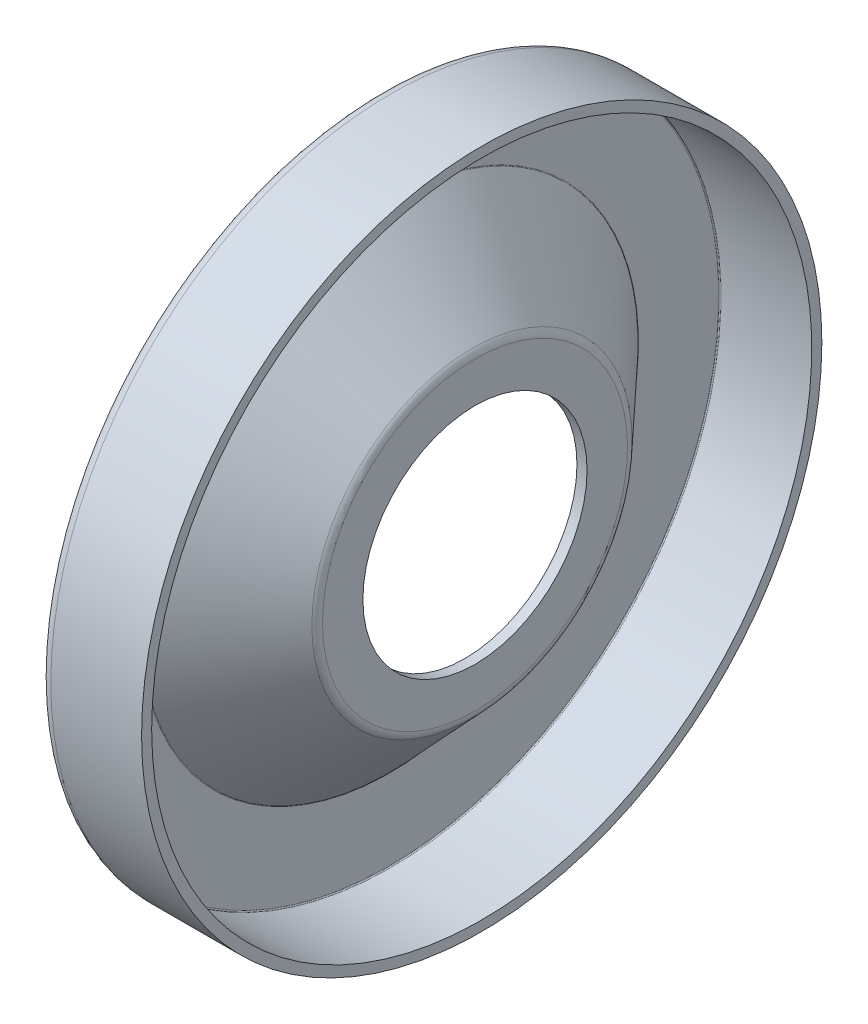
ISO-10303-21;
HEADER;
FILE_DESCRIPTION(('STEP AP214'),'2;1');
FILE_NAME('part.step','',(''),(''),'','','');
FILE_SCHEMA(('AUTOMOTIVE_DESIGN { 1 0 10303 214 1 1 1 1 }'));
ENDSEC;
DATA;
#1=APPLICATION_CONTEXT('core data for automotive mechanical design processes');
#2=APPLICATION_PROTOCOL_DEFINITION('international standard','automotive_design',2000,#1);
#3=PRODUCT_CONTEXT('',#1,'mechanical');
#4=PRODUCT('Part','Part','',(#3));
#5=PRODUCT_RELATED_PRODUCT_CATEGORY('part','',(#4));
#6=PRODUCT_DEFINITION_FORMATION('','',#4);
#7=PRODUCT_DEFINITION_CONTEXT('part definition',#1,'design');
#8=PRODUCT_DEFINITION('design','',#6,#7);
#9=PRODUCT_DEFINITION_SHAPE('','',#8);
#10=(LENGTH_UNIT() NAMED_UNIT(*) SI_UNIT(.MILLI.,.METRE.));
#11=(NAMED_UNIT(*) PLANE_ANGLE_UNIT() SI_UNIT($,.RADIAN.));
#12=(NAMED_UNIT(*) SI_UNIT($,.STERADIAN.) SOLID_ANGLE_UNIT());
#13=UNCERTAINTY_MEASURE_WITH_UNIT(LENGTH_MEASURE(1.E-05),#10,'distance_accuracy_value','');
#14=(GEOMETRIC_REPRESENTATION_CONTEXT(3) GLOBAL_UNCERTAINTY_ASSIGNED_CONTEXT((#13)) GLOBAL_UNIT_ASSIGNED_CONTEXT((#10,
#11,#12)) REPRESENTATION_CONTEXT('',''));
#15=CARTESIAN_POINT('',(0.,0.,0.));
#16=DIRECTION('',(0.,0.,1.));
#17=DIRECTION('',(1.,0.,0.));
#18=AXIS2_PLACEMENT_3D('',#15,#16,#17);
#19=CARTESIAN_POINT('',(0.,0.,0.));
#20=DIRECTION('',(-1.,0.,0.));
#21=DIRECTION('',(0.,0.,1.));
#22=AXIS2_PLACEMENT_3D('',#19,#20,#21);
#23=CYLINDRICAL_SURFACE('',#22,10.);
#24=CARTESIAN_POINT('',(0.,0.,0.));
#25=DIRECTION('',(-1.,0.,0.));
#26=DIRECTION('',(0.,0.,1.));
#27=AXIS2_PLACEMENT_3D('',#24,#25,#26);
#28=CIRCLE('',#27,10.);
#29=CARTESIAN_POINT('',(0.,0.,10.));
#30=VERTEX_POINT('',#29);
#31=EDGE_CURVE('E317',#30,#30,#28,.T.);
#32=CARTESIAN_POINT('',(0.900000000000012,0.,0.));
#33=DIRECTION('',(-1.,0.,0.));
#34=DIRECTION('',(0.,0.,1.));
#35=AXIS2_PLACEMENT_3D('',#32,#33,#34);
#36=CIRCLE('',#35,10.);
#37=CARTESIAN_POINT('',(0.900000000000012,0.,10.));
#38=VERTEX_POINT('',#37);
#39=EDGE_CURVE('E13',#38,#38,#36,.T.);
#40=CARTESIAN_POINT('',(0.,0.,10.));
#41=CARTESIAN_POINT('',(0.00937500000000032,0.,10.));
#42=CARTESIAN_POINT('',(0.0187500000000005,0.,10.));
#43=CARTESIAN_POINT('',(0.0375000000000007,0.,10.));
#44=CARTESIAN_POINT('',(0.0468750000000008,0.,10.));
#45=CARTESIAN_POINT('',(0.0656250000000011,0.,10.));
#46=CARTESIAN_POINT('',(0.0750000000000012,0.,10.));
#47=CARTESIAN_POINT('',(0.0937500000000014,0.,10.));
#48=CARTESIAN_POINT('',(0.103125000000002,0.,10.));
#49=CARTESIAN_POINT('',(0.121875000000002,0.,10.));
#50=CARTESIAN_POINT('',(0.131250000000002,0.,10.));
#51=CARTESIAN_POINT('',(0.150000000000002,0.,10.));
#52=CARTESIAN_POINT('',(0.159375000000002,0.,10.));
#53=CARTESIAN_POINT('',(0.178125000000003,0.,10.));
#54=CARTESIAN_POINT('',(0.187500000000003,0.,10.));
#55=CARTESIAN_POINT('',(0.206250000000003,0.,10.));
#56=CARTESIAN_POINT('',(0.215625000000003,0.,10.));
#57=CARTESIAN_POINT('',(0.234375000000003,0.,10.));
#58=CARTESIAN_POINT('',(0.243750000000003,0.,10.));
#59=CARTESIAN_POINT('',(0.262500000000004,0.,10.));
#60=CARTESIAN_POINT('',(0.271875000000004,0.,10.));
#61=CARTESIAN_POINT('',(0.290625000000004,0.,10.));
#62=CARTESIAN_POINT('',(0.300000000000004,0.,10.));
#63=CARTESIAN_POINT('',(0.318750000000004,0.,10.));
#64=CARTESIAN_POINT('',(0.328125000000004,0.,10.));
#65=CARTESIAN_POINT('',(0.346875000000005,0.,10.));
#66=CARTESIAN_POINT('',(0.356250000000005,0.,10.));
#67=CARTESIAN_POINT('',(0.375000000000005,0.,10.));
#68=CARTESIAN_POINT('',(0.384375000000005,0.,10.));
#69=CARTESIAN_POINT('',(0.403125000000006,0.,10.));
#70=CARTESIAN_POINT('',(0.412500000000006,0.,10.));
#71=CARTESIAN_POINT('',(0.431250000000006,0.,10.));
#72=CARTESIAN_POINT('',(0.440625000000006,0.,10.));
#73=CARTESIAN_POINT('',(0.459375000000006,0.,10.));
#74=CARTESIAN_POINT('',(0.468750000000006,0.,10.));
#75=CARTESIAN_POINT('',(0.487500000000007,0.,10.));
#76=CARTESIAN_POINT('',(0.496875000000007,0.,10.));
#77=CARTESIAN_POINT('',(0.515625000000007,0.,10.));
#78=CARTESIAN_POINT('',(0.525000000000007,0.,10.));
#79=CARTESIAN_POINT('',(0.543750000000007,0.,10.));
#80=CARTESIAN_POINT('',(0.553125000000008,0.,10.));
#81=CARTESIAN_POINT('',(0.571875000000008,0.,10.));
#82=CARTESIAN_POINT('',(0.581250000000008,0.,10.));
#83=CARTESIAN_POINT('',(0.600000000000008,0.,10.));
#84=CARTESIAN_POINT('',(0.609375000000008,0.,10.));
#85=CARTESIAN_POINT('',(0.628125000000008,0.,10.));
#86=CARTESIAN_POINT('',(0.637500000000009,0.,10.));
#87=CARTESIAN_POINT('',(0.656250000000009,0.,10.));
#88=CARTESIAN_POINT('',(0.665625000000009,0.,10.));
#89=CARTESIAN_POINT('',(0.684375000000009,0.,10.));
#90=CARTESIAN_POINT('',(0.693750000000009,0.,10.));
#91=CARTESIAN_POINT('',(0.71250000000001,0.,10.));
#92=CARTESIAN_POINT('',(0.72187500000001,0.,10.));
#93=CARTESIAN_POINT('',(0.74062500000001,0.,10.));
#94=CARTESIAN_POINT('',(0.75000000000001,0.,10.));
#95=CARTESIAN_POINT('',(0.76875000000001,0.,10.));
#96=CARTESIAN_POINT('',(0.778125000000011,0.,10.));
#97=CARTESIAN_POINT('',(0.796875000000011,0.,10.));
#98=CARTESIAN_POINT('',(0.806250000000011,0.,10.));
#99=CARTESIAN_POINT('',(0.825000000000011,0.,10.));
#100=CARTESIAN_POINT('',(0.834375000000011,0.,10.));
#101=CARTESIAN_POINT('',(0.853125000000011,0.,10.));
#102=CARTESIAN_POINT('',(0.862500000000012,0.,10.));
#103=CARTESIAN_POINT('',(0.881250000000012,0.,10.));
#104=CARTESIAN_POINT('',(0.890625000000012,0.,10.));
#105=CARTESIAN_POINT('',(0.900000000000012,0.,10.));
#106=B_SPLINE_CURVE_WITH_KNOTS('',3,(#40,#41,#42,#43,#44,#45,#46,#47,#48,#49,#50,#51,#52,#53,
#54,#55,#56,#57,#58,#59,#60,#61,#62,#63,#64,#65,#66,#67,#68,#69,#70,#71,#72,#73,#74,#75,#76,#77,
#78,#79,#80,#81,#82,#83,#84,#85,#86,#87,#88,#89,#90,#91,#92,#93,#94,#95,#96,#97,#98,#99,#100,
#101,#102,#103,#104,#105),.UNSPECIFIED.,.F.,.F.,(4,2,2,2,2,2,2,2,2,2,2,2,2,2,2,2,2,2,2,2,2,2,2,
2,2,2,2,2,2,2,2,2,4),(0.,0.0281250000000004,0.0562500000000007,0.0843750000000011,
0.112500000000001,0.140625000000002,0.168750000000002,0.196875000000003,0.225000000000003,
0.253125000000003,0.281250000000004,0.309375000000004,0.337500000000004,0.365625000000005,
0.393750000000005,0.421875000000006,0.450000000000006,0.478125000000006,0.506250000000007,
0.534375000000007,0.562500000000007,0.590625000000008,0.618750000000008,0.646875000000008,
0.675000000000009,0.703125000000009,0.73125000000001,0.75937500000001,0.78750000000001,
0.815625000000011,0.843750000000011,0.871875000000011,0.900000000000012),.UNSPECIFIED.);
#107=EDGE_CURVE('BSEAM265',#30,#38,#106,.T.);
#108=ORIENTED_EDGE('',*,*,#31,.T.);
#109=ORIENTED_EDGE('',*,*,#39,.F.);
#110=ORIENTED_EDGE('',*,*,#107,.T.);
#111=ORIENTED_EDGE('',*,*,#107,.F.);
#112=EDGE_LOOP('',(#108,#110,#109,#111));
#113=FACE_BOUND('',#112,.T.);
#114=ADVANCED_FACE('F265',(#113),#23,.F.);
#115=CARTESIAN_POINT('',(0.900000000000012,-10.,2.22044604925031E-13));
#116=DIRECTION('',(1.,0.,0.));
#117=DIRECTION('',(0.,0.,-1.));
#118=AXIS2_PLACEMENT_3D('',#115,#116,#117);
#119=PLANE('',#118);
#120=ORIENTED_EDGE('',*,*,#39,.T.);
#121=EDGE_LOOP('',(#120));
#122=FACE_BOUND('',#121,.T.);
#123=CARTESIAN_POINT('',(0.900000000000012,0.,0.));
#124=DIRECTION('',(-1.,0.,0.));
#125=DIRECTION('',(0.,0.,1.));
#126=AXIS2_PLACEMENT_3D('',#123,#124,#125);
#127=CIRCLE('',#126,13.6060895243851);
#128=CARTESIAN_POINT('',(0.900000000000011,0.,13.6060895243851));
#129=VERTEX_POINT('',#128);
#130=EDGE_CURVE('E271',#129,#129,#127,.T.);
#131=ORIENTED_EDGE('',*,*,#130,.F.);
#132=EDGE_LOOP('',(#131));
#133=FACE_BOUND('',#132,.T.);
#134=ADVANCED_FACE('F335',(#122,#133),#119,.T.);
#135=CARTESIAN_POINT('',(-0.099999999999989,0.,0.));
#136=DIRECTION('',(-1.,0.,0.));
#137=DIRECTION('',(0.,0.,1.));
#138=AXIS2_PLACEMENT_3D('',#135,#136,#137);
#139=TOROIDAL_SURFACE('',#138,13.6060895243851,1.);
#140=ORIENTED_EDGE('',*,*,#130,.T.);
#141=EDGE_LOOP('',(#140));
#142=FACE_BOUND('',#141,.T.);
#143=CARTESIAN_POINT('',(0.631353701619264,2.22044604925031E-13,0.));
#144=DIRECTION('',(-1.,0.,0.));
#145=DIRECTION('',(0.,0.,1.));
#146=AXIS2_PLACEMENT_3D('',#143,#144,#145);
#147=CIRCLE('',#146,14.2880878844476);
#148=CARTESIAN_POINT('',(0.631353701619265,-2.21639124327501E-13,14.2880878844475));
#149=VERTEX_POINT('',#148);
#150=EDGE_CURVE('E275',#149,#149,#147,.T.);
#151=ORIENTED_EDGE('',*,*,#150,.F.);
#152=EDGE_LOOP('',(#151));
#153=FACE_BOUND('',#152,.T.);
#154=ADVANCED_FACE('F339',(#142,#153),#139,.T.);
#155=CARTESIAN_POINT('',(-6.6731353701619,-2.22044604925031E-13,0.));
#156=DIRECTION('',(-1.,0.,0.));
#157=DIRECTION('',(0.,0.,1.));
#158=AXIS2_PLACEMENT_3D('',#155,#156,#157);
#159=CONICAL_SURFACE('',#158,22.1211934077428,0.820304748437334);
#160=CARTESIAN_POINT('',(-6.6731353701619,-2.22044604925031E-13,0.));
#161=DIRECTION('',(-1.,0.,0.));
#162=DIRECTION('',(0.,0.,1.));
#163=AXIS2_PLACEMENT_3D('',#160,#161,#162);
#164=CIRCLE('',#163,22.1211934077428);
#165=CARTESIAN_POINT('',(-6.6731353701619,-2.22044604925031E-13,22.1211934077428));
#166=VERTEX_POINT('',#165);
#167=EDGE_CURVE('E279',#166,#166,#164,.T.);
#168=CARTESIAN_POINT('',(0.631353701619265,-2.21639124327501E-13,14.2880878844475));
#169=CARTESIAN_POINT('',(0.555265273788211,-2.21643348083725E-13,14.3696827336485));
#170=CARTESIAN_POINT('',(0.479176845957157,-2.21647571839949E-13,14.4512775828494));
#171=CARTESIAN_POINT('',(0.32699999029505,-2.21656019352398E-13,14.6144672812514));
#172=CARTESIAN_POINT('',(0.250911562463996,-2.21660243108622E-13,14.6960621304524));
#173=CARTESIAN_POINT('',(0.0987347068018886,-2.21668690621071E-13,14.8592518288544));
#174=CARTESIAN_POINT('',(0.022646278970835,-2.21672914377295E-13,14.9408466780554));
#175=CARTESIAN_POINT('',(-0.129530576691272,-2.21681361889743E-13,15.1040363764574));
#176=CARTESIAN_POINT('',(-0.205619004522326,-2.21685585645968E-13,15.1856312256584));
#177=CARTESIAN_POINT('',(-0.357795860184434,-2.21694033158416E-13,15.3488209240604));
#178=CARTESIAN_POINT('',(-0.433884288015488,-2.2169825691464E-13,15.4304157732614));
#179=CARTESIAN_POINT('',(-0.586061143677596,-2.21706704427089E-13,15.5936054716634));
#180=CARTESIAN_POINT('',(-0.66214957150865,-2.21710928183313E-13,15.6752003208643));
#181=CARTESIAN_POINT('',(-0.814326427170757,-2.21719375695762E-13,15.8383900192663));
#182=CARTESIAN_POINT('',(-0.89041485500181,-2.21723599451986E-13,15.9199848684673));
#183=CARTESIAN_POINT('',(-1.04259171066392,-2.21732046964435E-13,16.0831745668693));
#184=CARTESIAN_POINT('',(-1.11868013849497,-2.21736270720659E-13,16.1647694160703));
#185=CARTESIAN_POINT('',(-1.27085699415708,-2.21744718233108E-13,16.3279591144723));
#186=CARTESIAN_POINT('',(-1.34694542198813,-2.21748941989332E-13,16.4095539636733));
#187=CARTESIAN_POINT('',(-1.49912227765024,-2.2175738950178E-13,16.5727436620753));
#188=CARTESIAN_POINT('',(-1.5752107054813,-2.21761613258005E-13,16.6543385112763));
#189=CARTESIAN_POINT('',(-1.7273875611434,-2.21770060770453E-13,16.8175282096782));
#190=CARTESIAN_POINT('',(-1.80347598897446,-2.21774284526677E-13,16.8991230588792));
#191=CARTESIAN_POINT('',(-1.95565284463656,-2.21782732039126E-13,17.0623127572812));
#192=CARTESIAN_POINT('',(-2.03174127246762,-2.2178695579535E-13,17.1439076064822));
#193=CARTESIAN_POINT('',(-2.18391812812973,-2.21795403307799E-13,17.3070973048842));
#194=CARTESIAN_POINT('',(-2.26000655596078,-2.21799627064023E-13,17.3886921540852));
#195=CARTESIAN_POINT('',(-2.41218341162289,-2.21808074576472E-13,17.5518818524872));
#196=CARTESIAN_POINT('',(-2.48827183945394,-2.21812298332696E-13,17.6334767016882));
#197=CARTESIAN_POINT('',(-2.64044869511605,-2.21820745845145E-13,17.7966664000902));
#198=CARTESIAN_POINT('',(-2.7165371229471,-2.21824969601369E-13,17.8782612492912));
#199=CARTESIAN_POINT('',(-2.86871397860921,-2.21833417113817E-13,18.0414509476931));
#200=CARTESIAN_POINT('',(-2.94480240644026,-2.21837640870042E-13,18.1230457968941));
#201=CARTESIAN_POINT('',(-3.09697926210237,-2.2184608838249E-13,18.2862354952961));
#202=CARTESIAN_POINT('',(-3.17306768993342,-2.21850312138715E-13,18.3678303444971));
#203=CARTESIAN_POINT('',(-3.32524454559553,-2.21858759651163E-13,18.5310200428991));
#204=CARTESIAN_POINT('',(-3.40133297342659,-2.21862983407387E-13,18.6126148921001));
#205=CARTESIAN_POINT('',(-3.55350982908869,-2.21871430919836E-13,18.7758045905021));
#206=CARTESIAN_POINT('',(-3.62959825691975,-2.2187565467606E-13,18.8573994397031));
#207=CARTESIAN_POINT('',(-3.78177511258185,-2.21884102188509E-13,19.0205891381051));
#208=CARTESIAN_POINT('',(-3.85786354041291,-2.21888325944733E-13,19.1021839873061));
#209=CARTESIAN_POINT('',(-4.01004039607502,-2.21896773457182E-13,19.265373685708));
#210=CARTESIAN_POINT('',(-4.08612882390607,-2.21900997213406E-13,19.346968534909));
#211=CARTESIAN_POINT('',(-4.23830567956818,-2.21909444725854E-13,19.510158233311));
#212=CARTESIAN_POINT('',(-4.31439410739923,-2.21913668482079E-13,19.591753082512));
#213=CARTESIAN_POINT('',(-4.46657096306134,-2.21922115994527E-13,19.754942780914));
#214=CARTESIAN_POINT('',(-4.54265939089239,-2.21926339750752E-13,19.836537630115));
#215=CARTESIAN_POINT('',(-4.6948362465545,-2.219347872632E-13,19.999727328517));
#216=CARTESIAN_POINT('',(-4.77092467438555,-2.21939011019424E-13,20.081322177718));
#217=CARTESIAN_POINT('',(-4.92310153004766,-2.21947458531873E-13,20.24451187612));
#218=CARTESIAN_POINT('',(-4.99918995787872,-2.21951682288097E-13,20.326106725321));
#219=CARTESIAN_POINT('',(-5.15136681354082,-2.21960129800546E-13,20.4892964237229));
#220=CARTESIAN_POINT('',(-5.22745524137188,-2.2196435355677E-13,20.5708912729239));
#221=CARTESIAN_POINT('',(-5.37963209703398,-2.21972801069219E-13,20.7340809713259));
#222=CARTESIAN_POINT('',(-5.45572052486504,-2.21977024825443E-13,20.8156758205269));
#223=CARTESIAN_POINT('',(-5.60789738052715,-2.21985472337891E-13,20.9788655189289));
#224=CARTESIAN_POINT('',(-5.6839858083582,-2.21989696094116E-13,21.0604603681299));
#225=CARTESIAN_POINT('',(-5.83616266402031,-2.21998143606564E-13,21.2236500665319));
#226=CARTESIAN_POINT('',(-5.91225109185136,-2.22002367362789E-13,21.3052449157329));
#227=CARTESIAN_POINT('',(-6.06442794751347,-2.22010814875237E-13,21.4684346141349));
#228=CARTESIAN_POINT('',(-6.14051637534452,-2.22015038631461E-13,21.5500294633359));
#229=CARTESIAN_POINT('',(-6.29269323100663,-2.2202348614391E-13,21.7132191617378));
#230=CARTESIAN_POINT('',(-6.36878165883768,-2.22027709900134E-13,21.7948140109388));
#231=CARTESIAN_POINT('',(-6.52095851449979,-2.22036157412583E-13,21.9580037093408));
#232=CARTESIAN_POINT('',(-6.59704694233084,-2.22040381168807E-13,22.0395985585418));
#233=CARTESIAN_POINT('',(-6.6731353701619,-2.22044604925031E-13,22.1211934077428));
#234=B_SPLINE_CURVE_WITH_KNOTS('',3,(#168,#169,#170,#171,#172,#173,#174,#175,#176,#177,#178,
#179,#180,#181,#182,#183,#184,#185,#186,#187,#188,#189,#190,#191,#192,#193,#194,#195,#196,#197,
#198,#199,#200,#201,#202,#203,#204,#205,#206,#207,#208,#209,#210,#211,#212,#213,#214,#215,#216,
#217,#218,#219,#220,#221,#222,#223,#224,#225,#226,#227,#228,#229,#230,#231,#232,#233),
.UNSPECIFIED.,.F.,.F.,(4,2,2,2,2,2,2,2,2,2,2,2,2,2,2,2,2,2,2,2,2,2,2,2,2,2,2,2,2,2,2,2,4),(0.,
0.334700633990149,0.6694012679803,1.00410190197045,1.3388025359606,1.67350316995075,
2.0082038039409,2.34290443793105,2.6776050719212,3.01230570591135,3.3470063399015,
3.68170697389165,4.0164076078818,4.35110824187196,4.6858088758621,5.02050950985225,
5.35521014384241,5.68991077783256,6.02461141182271,6.35931204581286,6.69401267980301,
7.02871331379316,7.36341394778331,7.69811458177346,8.03281521576361,8.36751584975376,
8.70221648374391,9.03691711773406,9.37161775172421,9.70631838571436,10.0410190197045,
10.3757196536947,10.7104202876848),.UNSPECIFIED.);
#235=EDGE_CURVE('BSEAM343',#149,#166,#234,.T.);
#236=ORIENTED_EDGE('',*,*,#150,.T.);
#237=ORIENTED_EDGE('',*,*,#167,.F.);
#238=ORIENTED_EDGE('',*,*,#235,.T.);
#239=ORIENTED_EDGE('',*,*,#235,.F.);
#240=EDGE_LOOP('',(#236,#238,#237,#239));
#241=FACE_BOUND('',#240,.T.);
#242=ADVANCED_FACE('F343',(#241),#159,.T.);
#243=CARTESIAN_POINT('',(-6.59999999999994,2.22044604925031E-13,1.11022302462516E-13));
#244=DIRECTION('',(-1.,0.,0.));
#245=DIRECTION('',(0.,0.,1.));
#246=AXIS2_PLACEMENT_3D('',#243,#244,#245);
#247=TOROIDAL_SURFACE('',#246,22.1893932437491,0.0999999999999989);
#248=ORIENTED_EDGE('',*,*,#167,.T.);
#249=EDGE_LOOP('',(#248));
#250=FACE_BOUND('',#249,.T.);
#251=CARTESIAN_POINT('',(-6.69999999999998,0.,0.));
#252=DIRECTION('',(-1.,0.,0.));
#253=DIRECTION('',(0.,0.,1.));
#254=AXIS2_PLACEMENT_3D('',#251,#252,#253);
#255=CIRCLE('',#254,22.1893932437491);
#256=CARTESIAN_POINT('',(-6.69999999999998,0.,22.1893932437491));
#257=VERTEX_POINT('',#256);
#258=EDGE_CURVE('E284',#257,#257,#255,.T.);
#259=ORIENTED_EDGE('',*,*,#258,.F.);
#260=EDGE_LOOP('',(#259));
#261=FACE_BOUND('',#260,.T.);
#262=ADVANCED_FACE('F349',(#250,#261),#247,.F.);
#263=CARTESIAN_POINT('',(-6.69999999999993,-22.1893932437491,1.11022302462516E-13));
#264=DIRECTION('',(1.,0.,0.));
#265=DIRECTION('',(0.,0.,-1.));
#266=AXIS2_PLACEMENT_3D('',#263,#264,#265);
#267=PLANE('',#266);
#268=ORIENTED_EDGE('',*,*,#258,.T.);
#269=EDGE_LOOP('',(#268));
#270=FACE_BOUND('',#269,.T.);
#271=CARTESIAN_POINT('',(-6.69999999999998,0.,0.));
#272=DIRECTION('',(-1.,0.,0.));
#273=DIRECTION('',(0.,0.,1.));
#274=AXIS2_PLACEMENT_3D('',#271,#272,#273);
#275=CIRCLE('',#274,29.35);
#276=CARTESIAN_POINT('',(-6.69999999999999,0.,29.3500000000001));
#277=VERTEX_POINT('',#276);
#278=EDGE_CURVE('E287',#277,#277,#275,.T.);
#279=ORIENTED_EDGE('',*,*,#278,.F.);
#280=EDGE_LOOP('',(#279));
#281=FACE_BOUND('',#280,.T.);
#282=ADVANCED_FACE('F353',(#270,#281),#267,.T.);
#283=CARTESIAN_POINT('',(-6.59999999999994,2.22044604925031E-13,1.11022302462516E-13));
#284=DIRECTION('',(-1.,0.,0.));
#285=DIRECTION('',(0.,0.,1.));
#286=AXIS2_PLACEMENT_3D('',#283,#284,#285);
#287=TOROIDAL_SURFACE('',#286,29.35,0.0999999999999998);
#288=ORIENTED_EDGE('',*,*,#278,.T.);
#289=EDGE_LOOP('',(#288));
#290=FACE_BOUND('',#289,.T.);
#291=CARTESIAN_POINT('',(-6.59999999999994,2.22044604925031E-13,1.11022302462516E-13));
#292=DIRECTION('',(-1.,0.,0.));
#293=DIRECTION('',(0.,0.,1.));
#294=AXIS2_PLACEMENT_3D('',#291,#292,#293);
#295=CIRCLE('',#294,29.45);
#296=CARTESIAN_POINT('',(-6.59999999999994,0.,29.45));
#297=VERTEX_POINT('',#296);
#298=EDGE_CURVE('E290',#297,#297,#295,.T.);
#299=ORIENTED_EDGE('',*,*,#298,.F.);
#300=EDGE_LOOP('',(#299));
#301=FACE_BOUND('',#300,.T.);
#302=ADVANCED_FACE('F357',(#290,#301),#287,.F.);
#303=CARTESIAN_POINT('',(0.,0.,0.));
#304=DIRECTION('',(-1.,0.,0.));
#305=DIRECTION('',(0.,0.,1.));
#306=AXIS2_PLACEMENT_3D('',#303,#304,#305);
#307=CYLINDRICAL_SURFACE('',#306,29.45);
#308=CARTESIAN_POINT('',(1.50000000000006,2.22044604925031E-13,0.));
#309=DIRECTION('',(-1.,0.,0.));
#310=DIRECTION('',(0.,0.,1.));
#311=AXIS2_PLACEMENT_3D('',#308,#309,#310);
#312=CIRCLE('',#311,29.45);
#313=CARTESIAN_POINT('',(1.50000000000006,0.,29.45));
#314=VERTEX_POINT('',#313);
#315=EDGE_CURVE('E293',#314,#314,#312,.T.);
#316=CARTESIAN_POINT('',(-6.59999999999994,0.,29.45));
#317=CARTESIAN_POINT('',(-6.51562499999994,0.,29.45));
#318=CARTESIAN_POINT('',(-6.43124999999994,0.,29.45));
#319=CARTESIAN_POINT('',(-6.26249999999994,0.,29.45));
#320=CARTESIAN_POINT('',(-6.17812499999994,0.,29.45));
#321=CARTESIAN_POINT('',(-6.00937499999994,0.,29.45));
#322=CARTESIAN_POINT('',(-5.92499999999994,0.,29.45));
#323=CARTESIAN_POINT('',(-5.75624999999994,0.,29.45));
#324=CARTESIAN_POINT('',(-5.67187499999994,0.,29.45));
#325=CARTESIAN_POINT('',(-5.50312499999994,0.,29.45));
#326=CARTESIAN_POINT('',(-5.41874999999994,0.,29.45));
#327=CARTESIAN_POINT('',(-5.24999999999994,0.,29.45));
#328=CARTESIAN_POINT('',(-5.16562499999994,0.,29.45));
#329=CARTESIAN_POINT('',(-4.99687499999994,0.,29.45));
#330=CARTESIAN_POINT('',(-4.91249999999994,0.,29.45));
#331=CARTESIAN_POINT('',(-4.74374999999994,0.,29.45));
#332=CARTESIAN_POINT('',(-4.65937499999994,0.,29.45));
#333=CARTESIAN_POINT('',(-4.49062499999994,0.,29.45));
#334=CARTESIAN_POINT('',(-4.40624999999994,0.,29.45));
#335=CARTESIAN_POINT('',(-4.23749999999994,0.,29.45));
#336=CARTESIAN_POINT('',(-4.15312499999994,0.,29.45));
#337=CARTESIAN_POINT('',(-3.98437499999994,0.,29.45));
#338=CARTESIAN_POINT('',(-3.89999999999994,0.,29.45));
#339=CARTESIAN_POINT('',(-3.73124999999994,0.,29.45));
#340=CARTESIAN_POINT('',(-3.64687499999994,0.,29.45));
#341=CARTESIAN_POINT('',(-3.47812499999994,0.,29.45));
#342=CARTESIAN_POINT('',(-3.39374999999994,0.,29.45));
#343=CARTESIAN_POINT('',(-3.22499999999994,0.,29.45));
#344=CARTESIAN_POINT('',(-3.14062499999994,0.,29.45));
#345=CARTESIAN_POINT('',(-2.97187499999994,0.,29.45));
#346=CARTESIAN_POINT('',(-2.88749999999994,0.,29.45));
#347=CARTESIAN_POINT('',(-2.71874999999994,0.,29.45));
#348=CARTESIAN_POINT('',(-2.63437499999994,0.,29.45));
#349=CARTESIAN_POINT('',(-2.46562499999994,0.,29.45));
#350=CARTESIAN_POINT('',(-2.38124999999994,0.,29.45));
#351=CARTESIAN_POINT('',(-2.21249999999994,0.,29.45));
#352=CARTESIAN_POINT('',(-2.12812499999994,0.,29.45));
#353=CARTESIAN_POINT('',(-1.95937499999994,0.,29.45));
#354=CARTESIAN_POINT('',(-1.87499999999994,0.,29.45));
#355=CARTESIAN_POINT('',(-1.70624999999994,0.,29.45));
#356=CARTESIAN_POINT('',(-1.62187499999994,0.,29.45));
#357=CARTESIAN_POINT('',(-1.45312499999994,0.,29.45));
#358=CARTESIAN_POINT('',(-1.36874999999994,0.,29.45));
#359=CARTESIAN_POINT('',(-1.19999999999994,0.,29.45));
#360=CARTESIAN_POINT('',(-1.11562499999994,0.,29.45));
#361=CARTESIAN_POINT('',(-0.946874999999941,0.,29.45));
#362=CARTESIAN_POINT('',(-0.862499999999941,0.,29.45));
#363=CARTESIAN_POINT('',(-0.693749999999941,0.,29.45));
#364=CARTESIAN_POINT('',(-0.609374999999941,0.,29.45));
#365=CARTESIAN_POINT('',(-0.440624999999941,0.,29.45));
#366=CARTESIAN_POINT('',(-0.356249999999941,0.,29.45));
#367=CARTESIAN_POINT('',(-0.187499999999941,0.,29.45));
#368=CARTESIAN_POINT('',(-0.103124999999941,0.,29.45));
#369=CARTESIAN_POINT('',(0.0656250000000585,0.,29.45));
#370=CARTESIAN_POINT('',(0.150000000000058,0.,29.45));
#371=CARTESIAN_POINT('',(0.318750000000059,0.,29.45));
#372=CARTESIAN_POINT('',(0.403125000000059,0.,29.45));
#373=CARTESIAN_POINT('',(0.571875000000059,0.,29.45));
#374=CARTESIAN_POINT('',(0.656250000000059,0.,29.45));
#375=CARTESIAN_POINT('',(0.825000000000059,0.,29.45));
#376=CARTESIAN_POINT('',(0.909375000000058,0.,29.45));
#377=CARTESIAN_POINT('',(1.07812500000006,0.,29.45));
#378=CARTESIAN_POINT('',(1.16250000000006,0.,29.45));
#379=CARTESIAN_POINT('',(1.33125000000006,0.,29.45));
#380=CARTESIAN_POINT('',(1.41562500000006,0.,29.45));
#381=CARTESIAN_POINT('',(1.50000000000006,0.,29.45));
#382=B_SPLINE_CURVE_WITH_KNOTS('',3,(#316,#317,#318,#319,#320,#321,#322,#323,#324,#325,#326,
#327,#328,#329,#330,#331,#332,#333,#334,#335,#336,#337,#338,#339,#340,#341,#342,#343,#344,#345,
#346,#347,#348,#349,#350,#351,#352,#353,#354,#355,#356,#357,#358,#359,#360,#361,#362,#363,#364,
#365,#366,#367,#368,#369,#370,#371,#372,#373,#374,#375,#376,#377,#378,#379,#380,#381),
.UNSPECIFIED.,.F.,.F.,(4,2,2,2,2,2,2,2,2,2,2,2,2,2,2,2,2,2,2,2,2,2,2,2,2,2,2,2,2,2,2,2,4),(0.,
0.253125,0.50625,0.759375,1.0125,1.265625,1.51875,1.771875,2.025,2.278125,2.53125,2.784375,
3.0375,3.290625,3.54375,3.796875,4.05,4.303125,4.55625,4.809375,5.0625,5.315625,5.56875,
5.821875,6.075,6.328125,6.58125,6.834375,7.0875,7.340625,7.59375,7.846875,8.1),.UNSPECIFIED.);
#383=EDGE_CURVE('BSEAM361',#297,#314,#382,.T.);
#384=ORIENTED_EDGE('',*,*,#298,.T.);
#385=ORIENTED_EDGE('',*,*,#315,.F.);
#386=ORIENTED_EDGE('',*,*,#383,.T.);
#387=ORIENTED_EDGE('',*,*,#383,.F.);
#388=EDGE_LOOP('',(#384,#386,#385,#387));
#389=FACE_BOUND('',#388,.T.);
#390=ADVANCED_FACE('F361',(#389),#307,.F.);
#391=CARTESIAN_POINT('',(1.50000000000006,-29.45,0.));
#392=DIRECTION('',(1.,0.,0.));
#393=DIRECTION('',(0.,0.,-1.));
#394=AXIS2_PLACEMENT_3D('',#391,#392,#393);
#395=PLANE('',#394);
#396=ORIENTED_EDGE('',*,*,#315,.T.);
#397=EDGE_LOOP('',(#396));
#398=FACE_BOUND('',#397,.T.);
#399=CARTESIAN_POINT('',(1.50000000000006,2.22044604925031E-13,0.));
#400=DIRECTION('',(-1.,0.,0.));
#401=DIRECTION('',(0.,0.,1.));
#402=AXIS2_PLACEMENT_3D('',#399,#400,#401);
#403=CIRCLE('',#402,30.35);
#404=CARTESIAN_POINT('',(1.50000000000006,0.,30.35));
#405=VERTEX_POINT('',#404);
#406=EDGE_CURVE('E296',#405,#405,#403,.T.);
#407=ORIENTED_EDGE('',*,*,#406,.F.);
#408=EDGE_LOOP('',(#407));
#409=FACE_BOUND('',#408,.T.);
#410=ADVANCED_FACE('F365',(#398,#409),#395,.T.);
#411=CARTESIAN_POINT('',(0.,0.,0.));
#412=DIRECTION('',(-1.,0.,0.));
#413=DIRECTION('',(0.,0.,1.));
#414=AXIS2_PLACEMENT_3D('',#411,#412,#413);
#415=CYLINDRICAL_SURFACE('',#414,30.35);
#416=CARTESIAN_POINT('',(-6.59999999999994,2.22044604925031E-13,1.11022302462516E-13));
#417=DIRECTION('',(-1.,0.,0.));
#418=DIRECTION('',(0.,0.,1.));
#419=AXIS2_PLACEMENT_3D('',#416,#417,#418);
#420=CIRCLE('',#419,30.35);
#421=CARTESIAN_POINT('',(-6.59999999999994,0.,30.35));
#422=VERTEX_POINT('',#421);
#423=EDGE_CURVE('E299',#422,#422,#420,.T.);
#424=CARTESIAN_POINT('',(1.50000000000006,0.,30.35));
#425=CARTESIAN_POINT('',(1.41562500000006,0.,30.35));
#426=CARTESIAN_POINT('',(1.33125000000006,0.,30.35));
#427=CARTESIAN_POINT('',(1.16250000000006,0.,30.35));
#428=CARTESIAN_POINT('',(1.07812500000006,0.,30.35));
#429=CARTESIAN_POINT('',(0.909375000000058,0.,30.35));
#430=CARTESIAN_POINT('',(0.825000000000058,0.,30.35));
#431=CARTESIAN_POINT('',(0.656250000000058,0.,30.35));
#432=CARTESIAN_POINT('',(0.571875000000058,0.,30.35));
#433=CARTESIAN_POINT('',(0.403125000000058,0.,30.35));
#434=CARTESIAN_POINT('',(0.318750000000058,0.,30.35));
#435=CARTESIAN_POINT('',(0.150000000000058,0.,30.35));
#436=CARTESIAN_POINT('',(0.0656250000000583,0.,30.35));
#437=CARTESIAN_POINT('',(-0.103124999999942,0.,30.35));
#438=CARTESIAN_POINT('',(-0.187499999999942,0.,30.35));
#439=CARTESIAN_POINT('',(-0.356249999999942,0.,30.35));
#440=CARTESIAN_POINT('',(-0.440624999999942,0.,30.35));
#441=CARTESIAN_POINT('',(-0.609374999999941,0.,30.35));
#442=CARTESIAN_POINT('',(-0.693749999999941,0.,30.35));
#443=CARTESIAN_POINT('',(-0.862499999999941,0.,30.35));
#444=CARTESIAN_POINT('',(-0.946874999999941,0.,30.35));
#445=CARTESIAN_POINT('',(-1.11562499999994,0.,30.35));
#446=CARTESIAN_POINT('',(-1.19999999999994,0.,30.35));
#447=CARTESIAN_POINT('',(-1.36874999999994,0.,30.35));
#448=CARTESIAN_POINT('',(-1.45312499999994,0.,30.35));
#449=CARTESIAN_POINT('',(-1.62187499999994,0.,30.35));
#450=CARTESIAN_POINT('',(-1.70624999999994,0.,30.35));
#451=CARTESIAN_POINT('',(-1.87499999999994,0.,30.35));
#452=CARTESIAN_POINT('',(-1.95937499999994,0.,30.35));
#453=CARTESIAN_POINT('',(-2.12812499999994,0.,30.35));
#454=CARTESIAN_POINT('',(-2.21249999999994,0.,30.35));
#455=CARTESIAN_POINT('',(-2.38124999999994,0.,30.35));
#456=CARTESIAN_POINT('',(-2.46562499999994,0.,30.35));
#457=CARTESIAN_POINT('',(-2.63437499999994,0.,30.35));
#458=CARTESIAN_POINT('',(-2.71874999999994,0.,30.35));
#459=CARTESIAN_POINT('',(-2.88749999999994,0.,30.35));
#460=CARTESIAN_POINT('',(-2.97187499999994,0.,30.35));
#461=CARTESIAN_POINT('',(-3.14062499999994,0.,30.35));
#462=CARTESIAN_POINT('',(-3.22499999999994,0.,30.35));
#463=CARTESIAN_POINT('',(-3.39374999999994,0.,30.35));
#464=CARTESIAN_POINT('',(-3.47812499999994,0.,30.35));
#465=CARTESIAN_POINT('',(-3.64687499999994,0.,30.35));
#466=CARTESIAN_POINT('',(-3.73124999999994,0.,30.35));
#467=CARTESIAN_POINT('',(-3.89999999999994,0.,30.35));
#468=CARTESIAN_POINT('',(-3.98437499999994,0.,30.35));
#469=CARTESIAN_POINT('',(-4.15312499999994,0.,30.35));
#470=CARTESIAN_POINT('',(-4.23749999999994,0.,30.35));
#471=CARTESIAN_POINT('',(-4.40624999999994,0.,30.35));
#472=CARTESIAN_POINT('',(-4.49062499999994,0.,30.35));
#473=CARTESIAN_POINT('',(-4.65937499999994,0.,30.35));
#474=CARTESIAN_POINT('',(-4.74374999999994,0.,30.35));
#475=CARTESIAN_POINT('',(-4.91249999999994,0.,30.35));
#476=CARTESIAN_POINT('',(-4.99687499999994,0.,30.35));
#477=CARTESIAN_POINT('',(-5.16562499999994,0.,30.35));
#478=CARTESIAN_POINT('',(-5.24999999999994,0.,30.35));
#479=CARTESIAN_POINT('',(-5.41874999999994,0.,30.35));
#480=CARTESIAN_POINT('',(-5.50312499999994,0.,30.35));
#481=CARTESIAN_POINT('',(-5.67187499999994,0.,30.35));
#482=CARTESIAN_POINT('',(-5.75624999999994,0.,30.35));
#483=CARTESIAN_POINT('',(-5.92499999999994,0.,30.35));
#484=CARTESIAN_POINT('',(-6.00937499999994,0.,30.35));
#485=CARTESIAN_POINT('',(-6.17812499999994,0.,30.35));
#486=CARTESIAN_POINT('',(-6.26249999999994,0.,30.35));
#487=CARTESIAN_POINT('',(-6.43124999999994,0.,30.35));
#488=CARTESIAN_POINT('',(-6.51562499999994,0.,30.35));
#489=CARTESIAN_POINT('',(-6.59999999999994,0.,30.35));
#490=B_SPLINE_CURVE_WITH_KNOTS('',3,(#424,#425,#426,#427,#428,#429,#430,#431,#432,#433,#434,
#435,#436,#437,#438,#439,#440,#441,#442,#443,#444,#445,#446,#447,#448,#449,#450,#451,#452,#453,
#454,#455,#456,#457,#458,#459,#460,#461,#462,#463,#464,#465,#466,#467,#468,#469,#470,#471,#472,
#473,#474,#475,#476,#477,#478,#479,#480,#481,#482,#483,#484,#485,#486,#487,#488,#489),
.UNSPECIFIED.,.F.,.F.,(4,2,2,2,2,2,2,2,2,2,2,2,2,2,2,2,2,2,2,2,2,2,2,2,2,2,2,2,2,2,2,2,4),(0.,
0.253125,0.50625,0.759375,1.0125,1.265625,1.51875,1.771875,2.025,2.278125,2.53125,2.784375,
3.0375,3.290625,3.54375,3.796875,4.05,4.303125,4.55625,4.809375,5.0625,5.315625,5.56875,
5.821875,6.075,6.328125,6.58125,6.834375,7.0875,7.340625,7.59375,7.846875,8.1),.UNSPECIFIED.);
#491=EDGE_CURVE('BSEAM369',#405,#422,#490,.T.);
#492=ORIENTED_EDGE('',*,*,#406,.T.);
#493=ORIENTED_EDGE('',*,*,#423,.F.);
#494=ORIENTED_EDGE('',*,*,#491,.T.);
#495=ORIENTED_EDGE('',*,*,#491,.F.);
#496=EDGE_LOOP('',(#492,#494,#493,#495));
#497=FACE_BOUND('',#496,.T.);
#498=ADVANCED_FACE('F369',(#497),#415,.T.);
#499=CARTESIAN_POINT('',(-6.59999999999994,2.22044604925031E-13,1.11022302462516E-13));
#500=DIRECTION('',(-1.,0.,0.));
#501=DIRECTION('',(0.,0.,1.));
#502=AXIS2_PLACEMENT_3D('',#499,#500,#501);
#503=TOROIDAL_SURFACE('',#502,29.35,1.);
#504=ORIENTED_EDGE('',*,*,#423,.T.);
#505=EDGE_LOOP('',(#504));
#506=FACE_BOUND('',#505,.T.);
#507=CARTESIAN_POINT('',(-7.60000000000005,0.,0.));
#508=DIRECTION('',(-1.,0.,0.));
#509=DIRECTION('',(0.,0.,1.));
#510=AXIS2_PLACEMENT_3D('',#507,#508,#509);
#511=CIRCLE('',#510,29.35);
#512=CARTESIAN_POINT('',(-7.60000000000005,0.,29.35));
#513=VERTEX_POINT('',#512);
#514=EDGE_CURVE('E302',#513,#513,#511,.T.);
#515=ORIENTED_EDGE('',*,*,#514,.F.);
#516=EDGE_LOOP('',(#515));
#517=FACE_BOUND('',#516,.T.);
#518=ADVANCED_FACE('F373',(#506,#517),#503,.T.);
#519=CARTESIAN_POINT('',(-7.60000000000005,-22.1893932437491,0.));
#520=DIRECTION('',(-1.,0.,0.));
#521=DIRECTION('',(0.,0.,1.));
#522=AXIS2_PLACEMENT_3D('',#519,#520,#521);
#523=PLANE('',#522);
#524=ORIENTED_EDGE('',*,*,#514,.T.);
#525=EDGE_LOOP('',(#524));
#526=FACE_BOUND('',#525,.T.);
#527=CARTESIAN_POINT('',(-7.60000000000005,0.,0.));
#528=DIRECTION('',(-1.,0.,0.));
#529=DIRECTION('',(0.,0.,1.));
#530=AXIS2_PLACEMENT_3D('',#527,#528,#529);
#531=CIRCLE('',#530,22.1893932437491);
#532=CARTESIAN_POINT('',(-7.60000000000005,0.,22.1893932437491));
#533=VERTEX_POINT('',#532);
#534=EDGE_CURVE('E305',#533,#533,#531,.T.);
#535=ORIENTED_EDGE('',*,*,#534,.F.);
#536=EDGE_LOOP('',(#535));
#537=FACE_BOUND('',#536,.T.);
#538=ADVANCED_FACE('F377',(#526,#537),#523,.T.);
#539=CARTESIAN_POINT('',(-6.59999999999994,2.22044604925031E-13,1.11022302462516E-13));
#540=DIRECTION('',(-1.,0.,0.));
#541=DIRECTION('',(0.,0.,1.));
#542=AXIS2_PLACEMENT_3D('',#539,#540,#541);
#543=TOROIDAL_SURFACE('',#542,22.1893932437491,1.);
#544=ORIENTED_EDGE('',*,*,#534,.T.);
#545=EDGE_LOOP('',(#544));
#546=FACE_BOUND('',#545,.T.);
#547=CARTESIAN_POINT('',(-7.33135370161919,2.22044604925031E-13,-1.66533453693773E-13));
#548=DIRECTION('',(-1.,0.,0.));
#549=DIRECTION('',(0.,0.,1.));
#550=AXIS2_PLACEMENT_3D('',#547,#548,#549);
#551=CIRCLE('',#550,21.5073948836866);
#552=CARTESIAN_POINT('',(-7.33135370161919,2.21639124327501E-13,21.5073948836868));
#553=VERTEX_POINT('',#552);
#554=EDGE_CURVE('E308',#553,#553,#551,.T.);
#555=ORIENTED_EDGE('',*,*,#554,.F.);
#556=EDGE_LOOP('',(#555));
#557=FACE_BOUND('',#556,.T.);
#558=ADVANCED_FACE('F381',(#546,#557),#543,.T.);
#559=CARTESIAN_POINT('',(-0.0268646298380304,2.22044604925031E-13,1.11022302462516E-13));
#560=DIRECTION('',(-1.,0.,0.));
#561=DIRECTION('',(0.,0.,1.));
#562=AXIS2_PLACEMENT_3D('',#559,#560,#561);
#563=CONICAL_SURFACE('',#562,13.6742893603913,0.820304748437334);
#564=CARTESIAN_POINT('',(-0.0268646298380304,2.22044604925031E-13,1.11022302462516E-13));
#565=DIRECTION('',(-1.,0.,0.));
#566=DIRECTION('',(0.,0.,1.));
#567=AXIS2_PLACEMENT_3D('',#564,#565,#566);
#568=CIRCLE('',#567,13.6742893603913);
#569=CARTESIAN_POINT('',(-0.0268646298380301,2.22044604925031E-13,13.6742893603914));
#570=VERTEX_POINT('',#569);
#571=EDGE_CURVE('E311',#570,#570,#568,.T.);
#572=CARTESIAN_POINT('',(-7.33135370161919,2.21639124327501E-13,21.5073948836868));
#573=CARTESIAN_POINT('',(-7.25526527378814,2.21643348083725E-13,21.4258000344858));
#574=CARTESIAN_POINT('',(-7.17917684595708,2.21647571839949E-13,21.3442051852848));
#575=CARTESIAN_POINT('',(-7.02699999029498,2.21656019352398E-13,21.1810154868828));
#576=CARTESIAN_POINT('',(-6.95091156246392,2.21660243108622E-13,21.0994206376818));
#577=CARTESIAN_POINT('',(-6.79873470680181,2.21668690621071E-13,20.9362309392798));
#578=CARTESIAN_POINT('',(-6.72264627897076,2.21672914377295E-13,20.8546360900788));
#579=CARTESIAN_POINT('',(-6.57046942330865,2.21681361889743E-13,20.6914463916768));
#580=CARTESIAN_POINT('',(-6.4943809954776,2.21685585645968E-13,20.6098515424758));
#581=CARTESIAN_POINT('',(-6.34220413981549,2.21694033158416E-13,20.4466618440739));
#582=CARTESIAN_POINT('',(-6.26611571198444,2.2169825691464E-13,20.3650669948729));
#583=CARTESIAN_POINT('',(-6.11393885632233,2.21706704427089E-13,20.2018772964709));
#584=CARTESIAN_POINT('',(-6.03785042849128,2.21710928183313E-13,20.1202824472699));
#585=CARTESIAN_POINT('',(-5.88567357282917,2.21719375695762E-13,19.9570927488679));
#586=CARTESIAN_POINT('',(-5.80958514499812,2.21723599451986E-13,19.8754978996669));
#587=CARTESIAN_POINT('',(-5.65740828933601,2.21732046964435E-13,19.7123082012649));
#588=CARTESIAN_POINT('',(-5.58131986150495,2.21736270720659E-13,19.6307133520639));
#589=CARTESIAN_POINT('',(-5.42914300584285,2.21744718233108E-13,19.4675236536619));
#590=CARTESIAN_POINT('',(-5.35305457801179,2.21748941989332E-13,19.3859288044609));
#591=CARTESIAN_POINT('',(-5.20087772234969,2.2175738950178E-13,19.222739106059));
#592=CARTESIAN_POINT('',(-5.12478929451863,2.21761613258005E-13,19.141144256858));
#593=CARTESIAN_POINT('',(-4.97261243885652,2.21770060770453E-13,18.977954558456));
#594=CARTESIAN_POINT('',(-4.89652401102547,2.21774284526677E-13,18.896359709255));
#595=CARTESIAN_POINT('',(-4.74434715536336,2.21782732039126E-13,18.733170010853));
#596=CARTESIAN_POINT('',(-4.66825872753231,2.2178695579535E-13,18.651575161652));
#597=CARTESIAN_POINT('',(-4.5160818718702,2.21795403307799E-13,18.48838546325));
#598=CARTESIAN_POINT('',(-4.43999344403915,2.21799627064023E-13,18.406790614049));
#599=CARTESIAN_POINT('',(-4.28781658837704,2.21808074576472E-13,18.243600915647));
#600=CARTESIAN_POINT('',(-4.21172816054599,2.21812298332696E-13,18.162006066446));
#601=CARTESIAN_POINT('',(-4.05955130488388,2.21820745845145E-13,17.9988163680441));
#602=CARTESIAN_POINT('',(-3.98346287705283,2.21824969601369E-13,17.9172215188431));
#603=CARTESIAN_POINT('',(-3.83128602139072,2.21833417113817E-13,17.7540318204411));
#604=CARTESIAN_POINT('',(-3.75519759355966,2.21837640870042E-13,17.6724369712401));
#605=CARTESIAN_POINT('',(-3.60302073789756,2.2184608838249E-13,17.5092472728381));
#606=CARTESIAN_POINT('',(-3.5269323100665,2.21850312138715E-13,17.4276524236371));
#607=CARTESIAN_POINT('',(-3.3747554544044,2.21858759651163E-13,17.2644627252351));
#608=CARTESIAN_POINT('',(-3.29866702657334,2.21862983407387E-13,17.1828678760341));
#609=CARTESIAN_POINT('',(-3.14649017091123,2.21871430919836E-13,17.0196781776321));
#610=CARTESIAN_POINT('',(-3.07040174308018,2.2187565467606E-13,16.9380833284311));
#611=CARTESIAN_POINT('',(-2.91822488741807,2.21884102188509E-13,16.7748936300292));
#612=CARTESIAN_POINT('',(-2.84213645958702,2.21888325944733E-13,16.6932987808282));
#613=CARTESIAN_POINT('',(-2.68995960392491,2.21896773457182E-13,16.5301090824262));
#614=CARTESIAN_POINT('',(-2.61387117609386,2.21900997213406E-13,16.4485142332252));
#615=CARTESIAN_POINT('',(-2.46169432043175,2.21909444725854E-13,16.2853245348232));
#616=CARTESIAN_POINT('',(-2.3856058926007,2.21913668482079E-13,16.2037296856222));
#617=CARTESIAN_POINT('',(-2.23342903693859,2.21922115994527E-13,16.0405399872202));
#618=CARTESIAN_POINT('',(-2.15734060910754,2.21926339750752E-13,15.9589451380192));
#619=CARTESIAN_POINT('',(-2.00516375344543,2.219347872632E-13,15.7957554396172));
#620=CARTESIAN_POINT('',(-1.92907532561437,2.21939011019424E-13,15.7141605904162));
#621=CARTESIAN_POINT('',(-1.77689846995227,2.21947458531873E-13,15.5509708920143));
#622=CARTESIAN_POINT('',(-1.70081004212121,2.21951682288097E-13,15.4693760428133));
#623=CARTESIAN_POINT('',(-1.54863318645911,2.21960129800546E-13,15.3061863444113));
#624=CARTESIAN_POINT('',(-1.47254475862805,2.2196435355677E-13,15.2245914952103));
#625=CARTESIAN_POINT('',(-1.32036790296594,2.21972801069219E-13,15.0614017968083));
#626=CARTESIAN_POINT('',(-1.24427947513489,2.21977024825443E-13,14.9798069476073));
#627=CARTESIAN_POINT('',(-1.09210261947278,2.21985472337891E-13,14.8166172492053));
#628=CARTESIAN_POINT('',(-1.01601419164173,2.21989696094116E-13,14.7350224000043));
#629=CARTESIAN_POINT('',(-0.863837335979621,2.21998143606564E-13,14.5718327016023));
#630=CARTESIAN_POINT('',(-0.787748908148568,2.22002367362789E-13,14.4902378524014));
#631=CARTESIAN_POINT('',(-0.63557205248646,2.22010814875237E-13,14.3270481539994));
#632=CARTESIAN_POINT('',(-0.559483624655406,2.22015038631461E-13,14.2454533047984));
#633=CARTESIAN_POINT('',(-0.407306768993299,2.2202348614391E-13,14.0822636063964));
#634=CARTESIAN_POINT('',(-0.331218341162245,2.22027709900134E-13,14.0006687571954));
#635=CARTESIAN_POINT('',(-0.179041485500138,2.22036157412583E-13,13.8374790587934));
#636=CARTESIAN_POINT('',(-0.102953057669084,2.22040381168807E-13,13.7558842095924));
#637=CARTESIAN_POINT('',(-0.0268646298380303,2.22044604925031E-13,13.6742893603914));
#638=B_SPLINE_CURVE_WITH_KNOTS('',3,(#572,#573,#574,#575,#576,#577,#578,#579,#580,#581,#582,
#583,#584,#585,#586,#587,#588,#589,#590,#591,#592,#593,#594,#595,#596,#597,#598,#599,#600,#601,
#602,#603,#604,#605,#606,#607,#608,#609,#610,#611,#612,#613,#614,#615,#616,#617,#618,#619,#620,
#621,#622,#623,#624,#625,#626,#627,#628,#629,#630,#631,#632,#633,#634,#635,#636,#637),
.UNSPECIFIED.,.F.,.F.,(4,2,2,2,2,2,2,2,2,2,2,2,2,2,2,2,2,2,2,2,2,2,2,2,2,2,2,2,2,2,2,2,4),(0.,
0.334700633990149,0.669401267980299,1.00410190197045,1.3388025359606,1.67350316995075,
2.0082038039409,2.34290443793105,2.6776050719212,3.01230570591135,3.3470063399015,
3.68170697389165,4.0164076078818,4.35110824187195,4.6858088758621,5.02050950985225,
5.3552101438424,5.68991077783255,6.02461141182271,6.35931204581286,6.69401267980301,
7.02871331379316,7.36341394778331,7.69811458177346,8.03281521576361,8.36751584975376,
8.70221648374391,9.03691711773406,9.37161775172421,9.70631838571436,10.0410190197045,
10.3757196536947,10.7104202876848),.UNSPECIFIED.);
#639=EDGE_CURVE('BSEAM331',#553,#570,#638,.T.);
#640=ORIENTED_EDGE('',*,*,#554,.T.);
#641=ORIENTED_EDGE('',*,*,#571,.F.);
#642=ORIENTED_EDGE('',*,*,#639,.T.);
#643=ORIENTED_EDGE('',*,*,#639,.F.);
#644=EDGE_LOOP('',(#640,#642,#641,#643));
#645=FACE_BOUND('',#644,.T.);
#646=ADVANCED_FACE('F331',(#645),#563,.F.);
#647=CARTESIAN_POINT('',(-0.099999999999989,0.,0.));
#648=DIRECTION('',(-1.,0.,0.));
#649=DIRECTION('',(0.,0.,1.));
#650=AXIS2_PLACEMENT_3D('',#647,#648,#649);
#651=TOROIDAL_SURFACE('',#650,13.6060895243851,0.0999999999999999);
#652=ORIENTED_EDGE('',*,*,#571,.T.);
#653=EDGE_LOOP('',(#652));
#654=FACE_BOUND('',#653,.T.);
#655=CARTESIAN_POINT('',(0.,0.,0.));
#656=DIRECTION('',(-1.,0.,0.));
#657=DIRECTION('',(0.,0.,1.));
#658=AXIS2_PLACEMENT_3D('',#655,#656,#657);
#659=CIRCLE('',#658,13.6060895243851);
#660=CARTESIAN_POINT('',(0.,0.,13.6060895243851));
#661=VERTEX_POINT('',#660);
#662=EDGE_CURVE('E314',#661,#661,#659,.T.);
#663=ORIENTED_EDGE('',*,*,#662,.F.);
#664=EDGE_LOOP('',(#663));
#665=FACE_BOUND('',#664,.T.);
#666=ADVANCED_FACE('F325',(#654,#665),#651,.F.);
#667=CARTESIAN_POINT('',(0.,-10.,-1.66533453693773E-13));
#668=DIRECTION('',(-1.,0.,0.));
#669=DIRECTION('',(0.,0.,1.));
#670=AXIS2_PLACEMENT_3D('',#667,#668,#669);
#671=PLANE('',#670);
#672=ORIENTED_EDGE('',*,*,#662,.T.);
#673=EDGE_LOOP('',(#672));
#674=FACE_BOUND('',#673,.T.);
#675=ORIENTED_EDGE('',*,*,#31,.F.);
#676=EDGE_LOOP('',(#675));
#677=FACE_BOUND('',#676,.T.);
#678=ADVANCED_FACE('F323',(#674,#677),#671,.T.);
#679=CLOSED_SHELL('',(#114,#134,#154,#242,#262,#282,#302,#390,#410,#498,#518,#538,#558,#646,
#666,#678));
#680=MANIFOLD_SOLID_BREP('B2',#679);
#681=ADVANCED_BREP_SHAPE_REPRESENTATION('',(#18,#680),#14);
#682=SHAPE_DEFINITION_REPRESENTATION(#9,#681);
ENDSEC;
END-ISO-10303-21;
